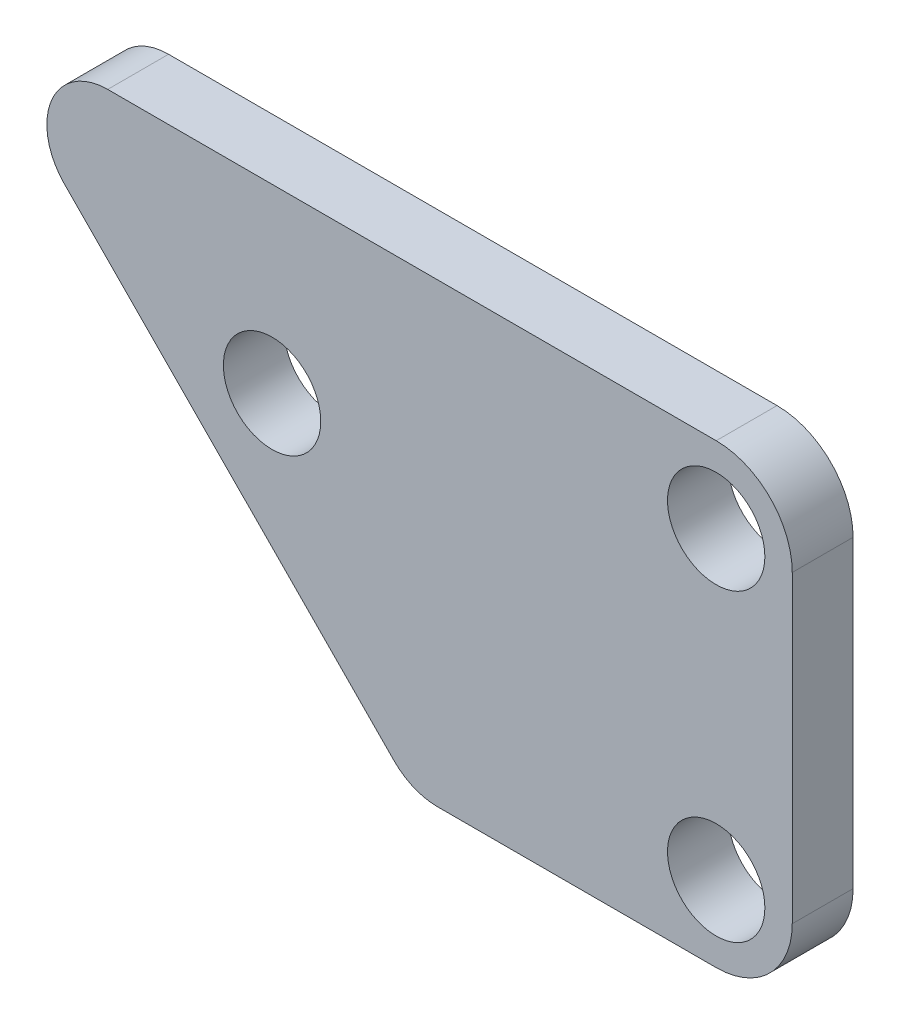
ISO-10303-21;
HEADER;
FILE_DESCRIPTION(('STEP AP214'),'2;1');
FILE_NAME('part.step','',(''),(''),'','','');
FILE_SCHEMA(('AUTOMOTIVE_DESIGN { 1 0 10303 214 1 1 1 1 }'));
ENDSEC;
DATA;
#1=APPLICATION_CONTEXT('core data for automotive mechanical design processes');
#2=APPLICATION_PROTOCOL_DEFINITION('international standard','automotive_design',2000,#1);
#3=PRODUCT_CONTEXT('',#1,'mechanical');
#4=PRODUCT('Part','Part','',(#3));
#5=PRODUCT_RELATED_PRODUCT_CATEGORY('part','',(#4));
#6=PRODUCT_DEFINITION_FORMATION('','',#4);
#7=PRODUCT_DEFINITION_CONTEXT('part definition',#1,'design');
#8=PRODUCT_DEFINITION('design','',#6,#7);
#9=PRODUCT_DEFINITION_SHAPE('','',#8);
#10=(LENGTH_UNIT() NAMED_UNIT(*) SI_UNIT(.MILLI.,.METRE.));
#11=(NAMED_UNIT(*) PLANE_ANGLE_UNIT() SI_UNIT($,.RADIAN.));
#12=(NAMED_UNIT(*) SI_UNIT($,.STERADIAN.) SOLID_ANGLE_UNIT());
#13=UNCERTAINTY_MEASURE_WITH_UNIT(LENGTH_MEASURE(1.E-05),#10,'distance_accuracy_value','');
#14=(GEOMETRIC_REPRESENTATION_CONTEXT(3) GLOBAL_UNCERTAINTY_ASSIGNED_CONTEXT((#13)) GLOBAL_UNIT_ASSIGNED_CONTEXT((#10,
#11,#12)) REPRESENTATION_CONTEXT('',''));
#15=CARTESIAN_POINT('',(0.,0.,0.));
#16=DIRECTION('',(0.,0.,1.));
#17=DIRECTION('',(1.,0.,0.));
#18=AXIS2_PLACEMENT_3D('',#15,#16,#17);
#19=CARTESIAN_POINT('',(0.,0.,2.));
#20=DIRECTION('',(0.,0.,1.));
#21=DIRECTION('',(1.,0.,0.));
#22=AXIS2_PLACEMENT_3D('',#19,#20,#21);
#23=PLANE('',#22);
#24=CARTESIAN_POINT('',(0.,-10.,2.));
#25=DIRECTION('',(0.,0.,1.));
#26=DIRECTION('',(1.,0.,0.));
#27=AXIS2_PLACEMENT_3D('',#24,#25,#26);
#28=CIRCLE('',#27,1.6);
#29=CARTESIAN_POINT('',(1.6,-10.,2.));
#30=VERTEX_POINT('',#29);
#31=EDGE_CURVE('E182',#30,#30,#28,.T.);
#32=ORIENTED_EDGE('',*,*,#31,.F.);
#33=EDGE_LOOP('',(#32));
#34=FACE_BOUND('',#33,.T.);
#35=CARTESIAN_POINT('',(0.,0.,2.));
#36=DIRECTION('',(0.,0.,1.));
#37=DIRECTION('',(1.,0.,0.));
#38=AXIS2_PLACEMENT_3D('',#35,#36,#37);
#39=CIRCLE('',#38,2.5);
#40=CARTESIAN_POINT('',(2.5,0.,2.));
#41=VERTEX_POINT('',#40);
#42=CARTESIAN_POINT('',(0.,2.5,2.));
#43=VERTEX_POINT('',#42);
#44=EDGE_CURVE('E145',#41,#43,#39,.T.);
#45=ORIENTED_EDGE('',*,*,#44,.T.);
#46=DIRECTION('',(-1.,0.,0.));
#47=VECTOR('',#46,1.);
#48=CARTESIAN_POINT('',(0.,2.5,2.));
#49=LINE('',#48,#47);
#50=CARTESIAN_POINT('',(-20.,2.5,2.));
#51=VERTEX_POINT('',#50);
#52=EDGE_CURVE('E93',#43,#51,#49,.T.);
#53=ORIENTED_EDGE('',*,*,#52,.T.);
#54=CARTESIAN_POINT('',(-20.,0.499999999999998,2.));
#55=DIRECTION('',(0.,0.,1.));
#56=DIRECTION('',(1.,0.,0.));
#57=AXIS2_PLACEMENT_3D('',#54,#55,#56);
#58=CIRCLE('',#57,2.);
#59=CARTESIAN_POINT('',(-21.4247187193256,-0.903629784096632,2.));
#60=VERTEX_POINT('',#59);
#61=EDGE_CURVE('E160',#51,#60,#58,.T.);
#62=ORIENTED_EDGE('',*,*,#61,.T.);
#63=DIRECTION('',(0.701814892048316,-0.712359359662811,0.));
#64=VECTOR('',#63,1.);
#65=CARTESIAN_POINT('',(-21.4247187193256,-0.903629784096632,2.));
#66=LINE('',#65,#64);
#67=CARTESIAN_POINT('',(-10.5875426398457,-11.9036297840966,2.));
#68=VERTEX_POINT('',#67);
#69=EDGE_CURVE('E173',#60,#68,#66,.T.);
#70=ORIENTED_EDGE('',*,*,#69,.T.);
#71=CARTESIAN_POINT('',(-9.16282392052004,-10.5,2.));
#72=DIRECTION('',(0.,0.,1.));
#73=DIRECTION('',(-1.,0.,0.));
#74=AXIS2_PLACEMENT_3D('',#71,#72,#73);
#75=CIRCLE('',#74,2.);
#76=CARTESIAN_POINT('',(-9.16282392052004,-12.5,2.));
#77=VERTEX_POINT('',#76);
#78=EDGE_CURVE('E112',#68,#77,#75,.T.);
#79=ORIENTED_EDGE('',*,*,#78,.T.);
#80=DIRECTION('',(1.,0.,0.));
#81=VECTOR('',#80,1.);
#82=CARTESIAN_POINT('',(-9.16282392052004,-12.5,2.));
#83=LINE('',#82,#81);
#84=CARTESIAN_POINT('',(0.,-12.5,2.));
#85=VERTEX_POINT('',#84);
#86=EDGE_CURVE('E106',#77,#85,#83,.T.);
#87=ORIENTED_EDGE('',*,*,#86,.T.);
#88=CARTESIAN_POINT('',(0.,-10.,2.));
#89=DIRECTION('',(0.,0.,1.));
#90=DIRECTION('',(1.,0.,0.));
#91=AXIS2_PLACEMENT_3D('',#88,#89,#90);
#92=CIRCLE('',#91,2.5);
#93=CARTESIAN_POINT('',(2.5,-10.,2.));
#94=VERTEX_POINT('',#93);
#95=EDGE_CURVE('E110',#85,#94,#92,.T.);
#96=ORIENTED_EDGE('',*,*,#95,.T.);
#97=DIRECTION('',(0.,1.,0.));
#98=VECTOR('',#97,1.);
#99=CARTESIAN_POINT('',(2.5,0.,2.));
#100=LINE('',#99,#98);
#101=EDGE_CURVE('E50',#94,#41,#100,.T.);
#102=ORIENTED_EDGE('',*,*,#101,.T.);
#103=EDGE_LOOP('',(#45,#53,#62,#70,#79,#87,#96,#102));
#104=FACE_BOUND('',#103,.T.);
#105=CARTESIAN_POINT('',(0.,0.,2.));
#106=DIRECTION('',(0.,0.,1.));
#107=DIRECTION('',(1.,0.,0.));
#108=AXIS2_PLACEMENT_3D('',#105,#106,#107);
#109=CIRCLE('',#108,1.6);
#110=CARTESIAN_POINT('',(1.6,0.,2.));
#111=VERTEX_POINT('',#110);
#112=EDGE_CURVE('E134',#111,#111,#109,.T.);
#113=ORIENTED_EDGE('',*,*,#112,.F.);
#114=EDGE_LOOP('',(#113));
#115=FACE_BOUND('',#114,.T.);
#116=CARTESIAN_POINT('',(-14.5978594321222,-3.45,2.));
#117=DIRECTION('',(0.,0.,1.));
#118=DIRECTION('',(1.,0.,0.));
#119=AXIS2_PLACEMENT_3D('',#116,#117,#118);
#120=CIRCLE('',#119,1.6);
#121=CARTESIAN_POINT('',(-12.9978594321222,-3.45,2.));
#122=VERTEX_POINT('',#121);
#123=EDGE_CURVE('E188',#122,#122,#120,.T.);
#124=ORIENTED_EDGE('',*,*,#123,.F.);
#125=EDGE_LOOP('',(#124));
#126=FACE_BOUND('',#125,.T.);
#127=ADVANCED_FACE('F33',(#34,#104,#115,#126),#23,.T.);
#128=CARTESIAN_POINT('',(0.,0.,0.));
#129=DIRECTION('',(0.,0.,1.));
#130=DIRECTION('',(1.,0.,0.));
#131=AXIS2_PLACEMENT_3D('',#128,#129,#130);
#132=PLANE('',#131);
#133=CARTESIAN_POINT('',(0.,0.,0.));
#134=DIRECTION('',(0.,0.,1.));
#135=DIRECTION('',(1.,0.,0.));
#136=AXIS2_PLACEMENT_3D('',#133,#134,#135);
#137=CIRCLE('',#136,2.5);
#138=CARTESIAN_POINT('',(2.5,0.,0.));
#139=VERTEX_POINT('',#138);
#140=CARTESIAN_POINT('',(0.,2.5,0.));
#141=VERTEX_POINT('',#140);
#142=EDGE_CURVE('E130',#139,#141,#137,.T.);
#143=ORIENTED_EDGE('',*,*,#142,.F.);
#144=DIRECTION('',(0.,1.,0.));
#145=VECTOR('',#144,1.);
#146=CARTESIAN_POINT('',(2.5,0.,0.));
#147=LINE('',#146,#145);
#148=CARTESIAN_POINT('',(2.5,-10.,0.));
#149=VERTEX_POINT('',#148);
#150=EDGE_CURVE('E85',#149,#139,#147,.T.);
#151=ORIENTED_EDGE('',*,*,#150,.F.);
#152=CARTESIAN_POINT('',(0.,-10.,0.));
#153=DIRECTION('',(0.,0.,1.));
#154=DIRECTION('',(1.,0.,0.));
#155=AXIS2_PLACEMENT_3D('',#152,#153,#154);
#156=CIRCLE('',#155,2.5);
#157=CARTESIAN_POINT('',(0.,-12.5,0.));
#158=VERTEX_POINT('',#157);
#159=EDGE_CURVE('E79',#158,#149,#156,.T.);
#160=ORIENTED_EDGE('',*,*,#159,.F.);
#161=DIRECTION('',(1.,0.,0.));
#162=VECTOR('',#161,1.);
#163=CARTESIAN_POINT('',(-9.16282392052004,-12.5,0.));
#164=LINE('',#163,#162);
#165=CARTESIAN_POINT('',(-9.16282392052004,-12.5,0.));
#166=VERTEX_POINT('',#165);
#167=EDGE_CURVE('E120',#166,#158,#164,.T.);
#168=ORIENTED_EDGE('',*,*,#167,.F.);
#169=CARTESIAN_POINT('',(-9.16282392052004,-10.5,0.));
#170=DIRECTION('',(0.,0.,1.));
#171=DIRECTION('',(-1.,0.,0.));
#172=AXIS2_PLACEMENT_3D('',#169,#170,#171);
#173=CIRCLE('',#172,2.);
#174=CARTESIAN_POINT('',(-10.5875426398457,-11.9036297840966,0.));
#175=VERTEX_POINT('',#174);
#176=EDGE_CURVE('E140',#175,#166,#173,.T.);
#177=ORIENTED_EDGE('',*,*,#176,.F.);
#178=DIRECTION('',(0.701814892048316,-0.712359359662811,0.));
#179=VECTOR('',#178,1.);
#180=CARTESIAN_POINT('',(-21.4247187193256,-0.903629784096632,0.));
#181=LINE('',#180,#179);
#182=CARTESIAN_POINT('',(-21.4247187193256,-0.903629784096632,0.));
#183=VERTEX_POINT('',#182);
#184=EDGE_CURVE('E138',#183,#175,#181,.T.);
#185=ORIENTED_EDGE('',*,*,#184,.F.);
#186=CARTESIAN_POINT('',(-20.,0.499999999999998,0.));
#187=DIRECTION('',(0.,0.,1.));
#188=DIRECTION('',(1.,0.,0.));
#189=AXIS2_PLACEMENT_3D('',#186,#187,#188);
#190=CIRCLE('',#189,2.);
#191=CARTESIAN_POINT('',(-20.,2.5,0.));
#192=VERTEX_POINT('',#191);
#193=EDGE_CURVE('E136',#192,#183,#190,.T.);
#194=ORIENTED_EDGE('',*,*,#193,.F.);
#195=DIRECTION('',(-1.,0.,0.));
#196=VECTOR('',#195,1.);
#197=CARTESIAN_POINT('',(0.,2.5,0.));
#198=LINE('',#197,#196);
#199=EDGE_CURVE('E133',#141,#192,#198,.T.);
#200=ORIENTED_EDGE('',*,*,#199,.F.);
#201=EDGE_LOOP('',(#143,#151,#160,#168,#177,#185,#194,#200));
#202=FACE_BOUND('',#201,.T.);
#203=CARTESIAN_POINT('',(0.,0.,0.));
#204=DIRECTION('',(0.,0.,1.));
#205=DIRECTION('',(1.,0.,0.));
#206=AXIS2_PLACEMENT_3D('',#203,#204,#205);
#207=CIRCLE('',#206,1.6);
#208=CARTESIAN_POINT('',(1.6,0.,0.));
#209=VERTEX_POINT('',#208);
#210=EDGE_CURVE('E179',#209,#209,#207,.T.);
#211=ORIENTED_EDGE('',*,*,#210,.T.);
#212=EDGE_LOOP('',(#211));
#213=FACE_BOUND('',#212,.T.);
#214=CARTESIAN_POINT('',(0.,-10.,0.));
#215=DIRECTION('',(0.,0.,1.));
#216=DIRECTION('',(1.,0.,0.));
#217=AXIS2_PLACEMENT_3D('',#214,#215,#216);
#218=CIRCLE('',#217,1.6);
#219=CARTESIAN_POINT('',(1.6,-10.,0.));
#220=VERTEX_POINT('',#219);
#221=EDGE_CURVE('E185',#220,#220,#218,.T.);
#222=ORIENTED_EDGE('',*,*,#221,.T.);
#223=EDGE_LOOP('',(#222));
#224=FACE_BOUND('',#223,.T.);
#225=CARTESIAN_POINT('',(-14.5978594321222,-3.45,0.));
#226=DIRECTION('',(0.,0.,1.));
#227=DIRECTION('',(1.,0.,0.));
#228=AXIS2_PLACEMENT_3D('',#225,#226,#227);
#229=CIRCLE('',#228,1.6);
#230=CARTESIAN_POINT('',(-12.9978594321222,-3.45,0.));
#231=VERTEX_POINT('',#230);
#232=EDGE_CURVE('E191',#231,#231,#229,.T.);
#233=ORIENTED_EDGE('',*,*,#232,.T.);
#234=EDGE_LOOP('',(#233));
#235=FACE_BOUND('',#234,.T.);
#236=ADVANCED_FACE('F164',(#202,#213,#224,#235),#132,.F.);
#237=CARTESIAN_POINT('',(0.,0.,2.));
#238=DIRECTION('',(0.,0.,-1.));
#239=DIRECTION('',(-1.,0.,0.));
#240=AXIS2_PLACEMENT_3D('',#237,#238,#239);
#241=CYLINDRICAL_SURFACE('',#240,2.5);
#242=ORIENTED_EDGE('',*,*,#142,.T.);
#243=DIRECTION('',(0.,0.,-1.));
#244=VECTOR('',#243,1.);
#245=CARTESIAN_POINT('',(0.,2.5,2.));
#246=LINE('',#245,#244);
#247=EDGE_CURVE('E11',#43,#141,#246,.T.);
#248=ORIENTED_EDGE('',*,*,#247,.F.);
#249=ORIENTED_EDGE('',*,*,#44,.F.);
#250=DIRECTION('',(0.,0.,-1.));
#251=VECTOR('',#250,1.);
#252=CARTESIAN_POINT('',(2.5,0.,2.));
#253=LINE('',#252,#251);
#254=EDGE_CURVE('E126',#41,#139,#253,.T.);
#255=ORIENTED_EDGE('',*,*,#254,.T.);
#256=EDGE_LOOP('',(#242,#248,#249,#255));
#257=FACE_BOUND('',#256,.T.);
#258=ADVANCED_FACE('F35',(#257),#241,.T.);
#259=CARTESIAN_POINT('',(0.,2.5,2.));
#260=DIRECTION('',(0.,-1.,0.));
#261=DIRECTION('',(1.,0.,0.));
#262=AXIS2_PLACEMENT_3D('',#259,#260,#261);
#263=PLANE('',#262);
#264=ORIENTED_EDGE('',*,*,#199,.T.);
#265=DIRECTION('',(0.,0.,-1.));
#266=VECTOR('',#265,1.);
#267=CARTESIAN_POINT('',(-20.,2.5,2.));
#268=LINE('',#267,#266);
#269=EDGE_CURVE('E42',#51,#192,#268,.T.);
#270=ORIENTED_EDGE('',*,*,#269,.F.);
#271=ORIENTED_EDGE('',*,*,#52,.F.);
#272=ORIENTED_EDGE('',*,*,#247,.T.);
#273=EDGE_LOOP('',(#264,#270,#271,#272));
#274=FACE_BOUND('',#273,.T.);
#275=ADVANCED_FACE('F224',(#274),#263,.F.);
#276=CARTESIAN_POINT('',(-20.,0.499999999999998,2.));
#277=DIRECTION('',(0.,0.,-1.));
#278=DIRECTION('',(-1.,0.,0.));
#279=AXIS2_PLACEMENT_3D('',#276,#277,#278);
#280=CYLINDRICAL_SURFACE('',#279,2.);
#281=ORIENTED_EDGE('',*,*,#193,.T.);
#282=DIRECTION('',(0.,0.,-1.));
#283=VECTOR('',#282,1.);
#284=CARTESIAN_POINT('',(-21.4247187193256,-0.903629784096632,2.));
#285=LINE('',#284,#283);
#286=EDGE_CURVE('E152',#60,#183,#285,.T.);
#287=ORIENTED_EDGE('',*,*,#286,.F.);
#288=ORIENTED_EDGE('',*,*,#61,.F.);
#289=ORIENTED_EDGE('',*,*,#269,.T.);
#290=EDGE_LOOP('',(#281,#287,#288,#289));
#291=FACE_BOUND('',#290,.T.);
#292=ADVANCED_FACE('F158',(#291),#280,.T.);
#293=CARTESIAN_POINT('',(-21.4247187193256,-0.903629784096632,2.));
#294=DIRECTION('',(0.712359359662811,0.701814892048316,0.));
#295=DIRECTION('',(-0.701814892048316,0.712359359662811,0.));
#296=AXIS2_PLACEMENT_3D('',#293,#294,#295);
#297=PLANE('',#296);
#298=ORIENTED_EDGE('',*,*,#184,.T.);
#299=DIRECTION('',(0.,0.,-1.));
#300=VECTOR('',#299,1.);
#301=CARTESIAN_POINT('',(-10.5875426398457,-11.9036297840966,2.));
#302=LINE('',#301,#300);
#303=EDGE_CURVE('E149',#68,#175,#302,.T.);
#304=ORIENTED_EDGE('',*,*,#303,.F.);
#305=ORIENTED_EDGE('',*,*,#69,.F.);
#306=ORIENTED_EDGE('',*,*,#286,.T.);
#307=EDGE_LOOP('',(#298,#304,#305,#306));
#308=FACE_BOUND('',#307,.T.);
#309=ADVANCED_FACE('F169',(#308),#297,.F.);
#310=CARTESIAN_POINT('',(-9.16282392052004,-10.5,2.));
#311=DIRECTION('',(0.,0.,-1.));
#312=DIRECTION('',(-1.,0.,0.));
#313=AXIS2_PLACEMENT_3D('',#310,#311,#312);
#314=CYLINDRICAL_SURFACE('',#313,2.);
#315=ORIENTED_EDGE('',*,*,#176,.T.);
#316=DIRECTION('',(0.,0.,-1.));
#317=VECTOR('',#316,1.);
#318=CARTESIAN_POINT('',(-9.16282392052004,-12.5,2.));
#319=LINE('',#318,#317);
#320=EDGE_CURVE('E121',#77,#166,#319,.T.);
#321=ORIENTED_EDGE('',*,*,#320,.F.);
#322=ORIENTED_EDGE('',*,*,#78,.F.);
#323=ORIENTED_EDGE('',*,*,#303,.T.);
#324=EDGE_LOOP('',(#315,#321,#322,#323));
#325=FACE_BOUND('',#324,.T.);
#326=ADVANCED_FACE('F172',(#325),#314,.T.);
#327=CARTESIAN_POINT('',(-9.16282392052004,-12.5,2.));
#328=DIRECTION('',(0.,1.,0.));
#329=DIRECTION('',(-1.,0.,0.));
#330=AXIS2_PLACEMENT_3D('',#327,#328,#329);
#331=PLANE('',#330);
#332=ORIENTED_EDGE('',*,*,#167,.T.);
#333=DIRECTION('',(0.,0.,-1.));
#334=VECTOR('',#333,1.);
#335=CARTESIAN_POINT('',(0.,-12.5,2.));
#336=LINE('',#335,#334);
#337=EDGE_CURVE('E117',#85,#158,#336,.T.);
#338=ORIENTED_EDGE('',*,*,#337,.F.);
#339=ORIENTED_EDGE('',*,*,#86,.F.);
#340=ORIENTED_EDGE('',*,*,#320,.T.);
#341=EDGE_LOOP('',(#332,#338,#339,#340));
#342=FACE_BOUND('',#341,.T.);
#343=ADVANCED_FACE('F118',(#342),#331,.F.);
#344=CARTESIAN_POINT('',(0.,-10.,2.));
#345=DIRECTION('',(0.,0.,-1.));
#346=DIRECTION('',(-1.,0.,0.));
#347=AXIS2_PLACEMENT_3D('',#344,#345,#346);
#348=CYLINDRICAL_SURFACE('',#347,2.5);
#349=ORIENTED_EDGE('',*,*,#159,.T.);
#350=DIRECTION('',(0.,0.,-1.));
#351=VECTOR('',#350,1.);
#352=CARTESIAN_POINT('',(2.5,-10.,2.));
#353=LINE('',#352,#351);
#354=EDGE_CURVE('E122',#94,#149,#353,.T.);
#355=ORIENTED_EDGE('',*,*,#354,.F.);
#356=ORIENTED_EDGE('',*,*,#95,.F.);
#357=ORIENTED_EDGE('',*,*,#337,.T.);
#358=EDGE_LOOP('',(#349,#355,#356,#357));
#359=FACE_BOUND('',#358,.T.);
#360=ADVANCED_FACE('F124',(#359),#348,.T.);
#361=CARTESIAN_POINT('',(2.5,0.,2.));
#362=DIRECTION('',(-1.,0.,0.));
#363=DIRECTION('',(0.,-1.,0.));
#364=AXIS2_PLACEMENT_3D('',#361,#362,#363);
#365=PLANE('',#364);
#366=ORIENTED_EDGE('',*,*,#150,.T.);
#367=ORIENTED_EDGE('',*,*,#254,.F.);
#368=ORIENTED_EDGE('',*,*,#101,.F.);
#369=ORIENTED_EDGE('',*,*,#354,.T.);
#370=EDGE_LOOP('',(#366,#367,#368,#369));
#371=FACE_BOUND('',#370,.T.);
#372=ADVANCED_FACE('F212',(#371),#365,.F.);
#373=CARTESIAN_POINT('',(0.,0.,2.));
#374=DIRECTION('',(0.,0.,-1.));
#375=DIRECTION('',(-1.,0.,0.));
#376=AXIS2_PLACEMENT_3D('',#373,#374,#375);
#377=CYLINDRICAL_SURFACE('',#376,1.6);
#378=ORIENTED_EDGE('',*,*,#112,.T.);
#379=EDGE_LOOP('',(#378));
#380=FACE_BOUND('',#379,.T.);
#381=ORIENTED_EDGE('',*,*,#210,.F.);
#382=EDGE_LOOP('',(#381));
#383=FACE_BOUND('',#382,.T.);
#384=ADVANCED_FACE('F209',(#380,#383),#377,.F.);
#385=CARTESIAN_POINT('',(0.,-10.,2.));
#386=DIRECTION('',(0.,0.,-1.));
#387=DIRECTION('',(-1.,0.,0.));
#388=AXIS2_PLACEMENT_3D('',#385,#386,#387);
#389=CYLINDRICAL_SURFACE('',#388,1.6);
#390=ORIENTED_EDGE('',*,*,#31,.T.);
#391=EDGE_LOOP('',(#390));
#392=FACE_BOUND('',#391,.T.);
#393=ORIENTED_EDGE('',*,*,#221,.F.);
#394=EDGE_LOOP('',(#393));
#395=FACE_BOUND('',#394,.T.);
#396=ADVANCED_FACE('F288',(#392,#395),#389,.F.);
#397=CARTESIAN_POINT('',(-14.5978594321222,-3.45,2.));
#398=DIRECTION('',(0.,0.,-1.));
#399=DIRECTION('',(-1.,0.,0.));
#400=AXIS2_PLACEMENT_3D('',#397,#398,#399);
#401=CYLINDRICAL_SURFACE('',#400,1.6);
#402=ORIENTED_EDGE('',*,*,#123,.T.);
#403=EDGE_LOOP('',(#402));
#404=FACE_BOUND('',#403,.T.);
#405=ORIENTED_EDGE('',*,*,#232,.F.);
#406=EDGE_LOOP('',(#405));
#407=FACE_BOUND('',#406,.T.);
#408=ADVANCED_FACE('F197',(#404,#407),#401,.F.);
#409=CLOSED_SHELL('',(#127,#236,#258,#275,#292,#309,#326,#343,#360,#372,#384,#396,#408));
#410=MANIFOLD_SOLID_BREP('B2',#409);
#411=ADVANCED_BREP_SHAPE_REPRESENTATION('',(#18,#410),#14);
#412=SHAPE_DEFINITION_REPRESENTATION(#9,#411);
ENDSEC;
END-ISO-10303-21;
